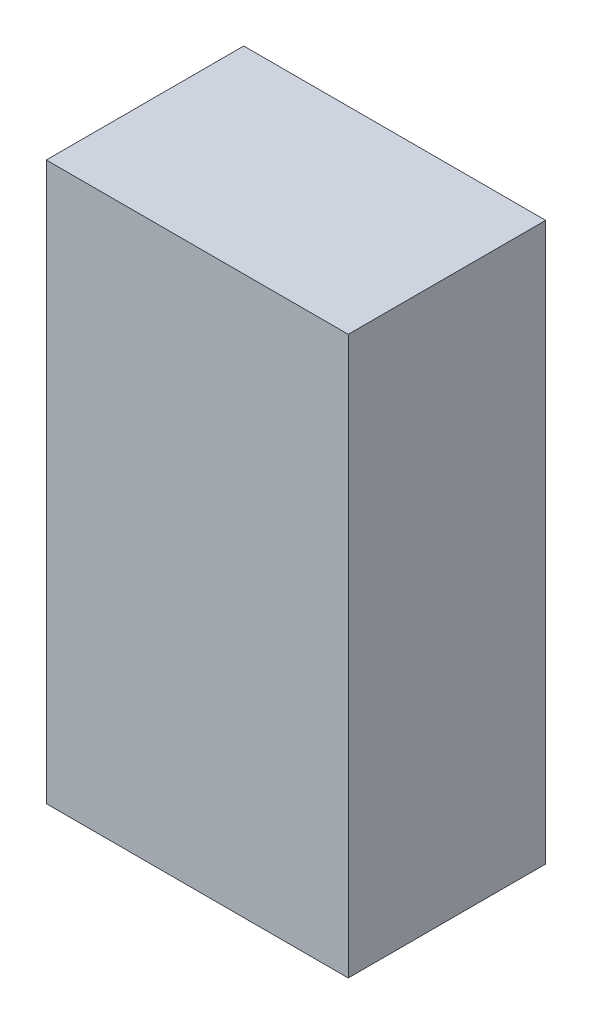
ISO-10303-21;
HEADER;
FILE_DESCRIPTION(('STEP AP214'),'2;1');
FILE_NAME('part.step','',(''),(''),'','','');
FILE_SCHEMA(('AUTOMOTIVE_DESIGN { 1 0 10303 214 1 1 1 1 }'));
ENDSEC;
DATA;
#1=APPLICATION_CONTEXT('core data for automotive mechanical design processes');
#2=APPLICATION_PROTOCOL_DEFINITION('international standard','automotive_design',2000,#1);
#3=PRODUCT_CONTEXT('',#1,'mechanical');
#4=PRODUCT('Part','Part','',(#3));
#5=PRODUCT_RELATED_PRODUCT_CATEGORY('part','',(#4));
#6=PRODUCT_DEFINITION_FORMATION('','',#4);
#7=PRODUCT_DEFINITION_CONTEXT('part definition',#1,'design');
#8=PRODUCT_DEFINITION('design','',#6,#7);
#9=PRODUCT_DEFINITION_SHAPE('','',#8);
#10=(LENGTH_UNIT() NAMED_UNIT(*) SI_UNIT(.MILLI.,.METRE.));
#11=(NAMED_UNIT(*) PLANE_ANGLE_UNIT() SI_UNIT($,.RADIAN.));
#12=(NAMED_UNIT(*) SI_UNIT($,.STERADIAN.) SOLID_ANGLE_UNIT());
#13=UNCERTAINTY_MEASURE_WITH_UNIT(LENGTH_MEASURE(1.E-05),#10,'distance_accuracy_value','');
#14=(GEOMETRIC_REPRESENTATION_CONTEXT(3) GLOBAL_UNCERTAINTY_ASSIGNED_CONTEXT((#13)) GLOBAL_UNIT_ASSIGNED_CONTEXT((#10,
#11,#12)) REPRESENTATION_CONTEXT('',''));
#15=CARTESIAN_POINT('',(0.,0.,0.));
#16=DIRECTION('',(0.,0.,1.));
#17=DIRECTION('',(1.,0.,0.));
#18=AXIS2_PLACEMENT_3D('',#15,#16,#17);
#19=CARTESIAN_POINT('',(13.,-24.,8.5));
#20=DIRECTION('',(-1.,0.,0.));
#21=DIRECTION('',(0.,0.,1.));
#22=AXIS2_PLACEMENT_3D('',#19,#20,#21);
#23=PLANE('',#22);
#24=DIRECTION('',(0.,1.,0.));
#25=VECTOR('',#24,1.);
#26=CARTESIAN_POINT('',(13.,-24.,-8.5));
#27=LINE('',#26,#25);
#28=CARTESIAN_POINT('',(13.,-24.,-8.5));
#29=VERTEX_POINT('',#28);
#30=CARTESIAN_POINT('',(13.,24.,-8.5));
#31=VERTEX_POINT('',#30);
#32=EDGE_CURVE('E107',#29,#31,#27,.T.);
#33=ORIENTED_EDGE('',*,*,#32,.T.);
#34=DIRECTION('',(0.,0.,-1.));
#35=VECTOR('',#34,1.);
#36=CARTESIAN_POINT('',(13.,24.,8.5));
#37=LINE('',#36,#35);
#38=CARTESIAN_POINT('',(13.,24.,8.5));
#39=VERTEX_POINT('',#38);
#40=EDGE_CURVE('E11',#39,#31,#37,.T.);
#41=ORIENTED_EDGE('',*,*,#40,.F.);
#42=DIRECTION('',(0.,1.,0.));
#43=VECTOR('',#42,1.);
#44=CARTESIAN_POINT('',(13.,-24.,8.5));
#45=LINE('',#44,#43);
#46=CARTESIAN_POINT('',(13.,-24.,8.5));
#47=VERTEX_POINT('',#46);
#48=EDGE_CURVE('E91',#47,#39,#45,.T.);
#49=ORIENTED_EDGE('',*,*,#48,.F.);
#50=DIRECTION('',(0.,0.,-1.));
#51=VECTOR('',#50,1.);
#52=CARTESIAN_POINT('',(13.,-24.,8.5));
#53=LINE('',#52,#51);
#54=EDGE_CURVE('E103',#47,#29,#53,.T.);
#55=ORIENTED_EDGE('',*,*,#54,.T.);
#56=EDGE_LOOP('',(#33,#41,#49,#55));
#57=FACE_BOUND('',#56,.T.);
#58=ADVANCED_FACE('F39',(#57),#23,.F.);
#59=CARTESIAN_POINT('',(-13.,24.,8.5));
#60=DIRECTION('',(0.,-1.,0.));
#61=DIRECTION('',(0.,0.,-1.));
#62=AXIS2_PLACEMENT_3D('',#59,#60,#61);
#63=PLANE('',#62);
#64=DIRECTION('',(-1.,0.,0.));
#65=VECTOR('',#64,1.);
#66=CARTESIAN_POINT('',(-13.,24.,-8.5));
#67=LINE('',#66,#65);
#68=CARTESIAN_POINT('',(-13.,24.,-8.5));
#69=VERTEX_POINT('',#68);
#70=EDGE_CURVE('E96',#31,#69,#67,.T.);
#71=ORIENTED_EDGE('',*,*,#70,.T.);
#72=DIRECTION('',(0.,0.,-1.));
#73=VECTOR('',#72,1.);
#74=CARTESIAN_POINT('',(-13.,24.,8.5));
#75=LINE('',#74,#73);
#76=CARTESIAN_POINT('',(-13.,24.,8.5));
#77=VERTEX_POINT('',#76);
#78=EDGE_CURVE('E48',#77,#69,#75,.T.);
#79=ORIENTED_EDGE('',*,*,#78,.F.);
#80=DIRECTION('',(-1.,0.,0.));
#81=VECTOR('',#80,1.);
#82=CARTESIAN_POINT('',(-13.,24.,8.5));
#83=LINE('',#82,#81);
#84=EDGE_CURVE('E86',#39,#77,#83,.T.);
#85=ORIENTED_EDGE('',*,*,#84,.F.);
#86=ORIENTED_EDGE('',*,*,#40,.T.);
#87=EDGE_LOOP('',(#71,#79,#85,#86));
#88=FACE_BOUND('',#87,.T.);
#89=ADVANCED_FACE('F95',(#88),#63,.F.);
#90=CARTESIAN_POINT('',(-13.,-24.,8.5));
#91=DIRECTION('',(1.,0.,0.));
#92=DIRECTION('',(0.,0.,-1.));
#93=AXIS2_PLACEMENT_3D('',#90,#91,#92);
#94=PLANE('',#93);
#95=DIRECTION('',(0.,-1.,0.));
#96=VECTOR('',#95,1.);
#97=CARTESIAN_POINT('',(-13.,-24.,-8.5));
#98=LINE('',#97,#96);
#99=CARTESIAN_POINT('',(-13.,-24.,-8.5));
#100=VERTEX_POINT('',#99);
#101=EDGE_CURVE('E73',#69,#100,#98,.T.);
#102=ORIENTED_EDGE('',*,*,#101,.T.);
#103=DIRECTION('',(0.,0.,-1.));
#104=VECTOR('',#103,1.);
#105=CARTESIAN_POINT('',(-13.,-24.,8.5));
#106=LINE('',#105,#104);
#107=CARTESIAN_POINT('',(-13.,-24.,8.5));
#108=VERTEX_POINT('',#107);
#109=EDGE_CURVE('E98',#108,#100,#106,.T.);
#110=ORIENTED_EDGE('',*,*,#109,.F.);
#111=DIRECTION('',(0.,-1.,0.));
#112=VECTOR('',#111,1.);
#113=CARTESIAN_POINT('',(-13.,-24.,8.5));
#114=LINE('',#113,#112);
#115=EDGE_CURVE('E89',#77,#108,#114,.T.);
#116=ORIENTED_EDGE('',*,*,#115,.F.);
#117=ORIENTED_EDGE('',*,*,#78,.T.);
#118=EDGE_LOOP('',(#102,#110,#116,#117));
#119=FACE_BOUND('',#118,.T.);
#120=ADVANCED_FACE('F99',(#119),#94,.F.);
#121=CARTESIAN_POINT('',(-13.,-24.,8.5));
#122=DIRECTION('',(0.,1.,0.));
#123=DIRECTION('',(0.,0.,1.));
#124=AXIS2_PLACEMENT_3D('',#121,#122,#123);
#125=PLANE('',#124);
#126=DIRECTION('',(1.,0.,0.));
#127=VECTOR('',#126,1.);
#128=CARTESIAN_POINT('',(-13.,-24.,-8.5));
#129=LINE('',#128,#127);
#130=EDGE_CURVE('E79',#100,#29,#129,.T.);
#131=ORIENTED_EDGE('',*,*,#130,.T.);
#132=ORIENTED_EDGE('',*,*,#54,.F.);
#133=DIRECTION('',(1.,0.,0.));
#134=VECTOR('',#133,1.);
#135=CARTESIAN_POINT('',(-13.,-24.,8.5));
#136=LINE('',#135,#134);
#137=EDGE_CURVE('E56',#108,#47,#136,.T.);
#138=ORIENTED_EDGE('',*,*,#137,.F.);
#139=ORIENTED_EDGE('',*,*,#109,.T.);
#140=EDGE_LOOP('',(#131,#132,#138,#139));
#141=FACE_BOUND('',#140,.T.);
#142=ADVANCED_FACE('F120',(#141),#125,.F.);
#143=CARTESIAN_POINT('',(0.,0.,8.5));
#144=DIRECTION('',(0.,0.,-1.));
#145=DIRECTION('',(-1.,0.,0.));
#146=AXIS2_PLACEMENT_3D('',#143,#144,#145);
#147=PLANE('',#146);
#148=ORIENTED_EDGE('',*,*,#48,.T.);
#149=ORIENTED_EDGE('',*,*,#84,.T.);
#150=ORIENTED_EDGE('',*,*,#115,.T.);
#151=ORIENTED_EDGE('',*,*,#137,.T.);
#152=EDGE_LOOP('',(#148,#149,#150,#151));
#153=FACE_BOUND('',#152,.T.);
#154=ADVANCED_FACE('F87',(#153),#147,.F.);
#155=CARTESIAN_POINT('',(0.,0.,-8.5));
#156=DIRECTION('',(0.,0.,-1.));
#157=DIRECTION('',(-1.,0.,0.));
#158=AXIS2_PLACEMENT_3D('',#155,#156,#157);
#159=PLANE('',#158);
#160=ORIENTED_EDGE('',*,*,#32,.F.);
#161=ORIENTED_EDGE('',*,*,#130,.F.);
#162=ORIENTED_EDGE('',*,*,#101,.F.);
#163=ORIENTED_EDGE('',*,*,#70,.F.);
#164=EDGE_LOOP('',(#160,#161,#162,#163));
#165=FACE_BOUND('',#164,.T.);
#166=ADVANCED_FACE('F123',(#165),#159,.T.);
#167=CLOSED_SHELL('',(#58,#89,#120,#142,#154,#166));
#168=MANIFOLD_SOLID_BREP('B2',#167);
#169=ADVANCED_BREP_SHAPE_REPRESENTATION('',(#18,#168),#14);
#170=SHAPE_DEFINITION_REPRESENTATION(#9,#169);
ENDSEC;
END-ISO-10303-21;
